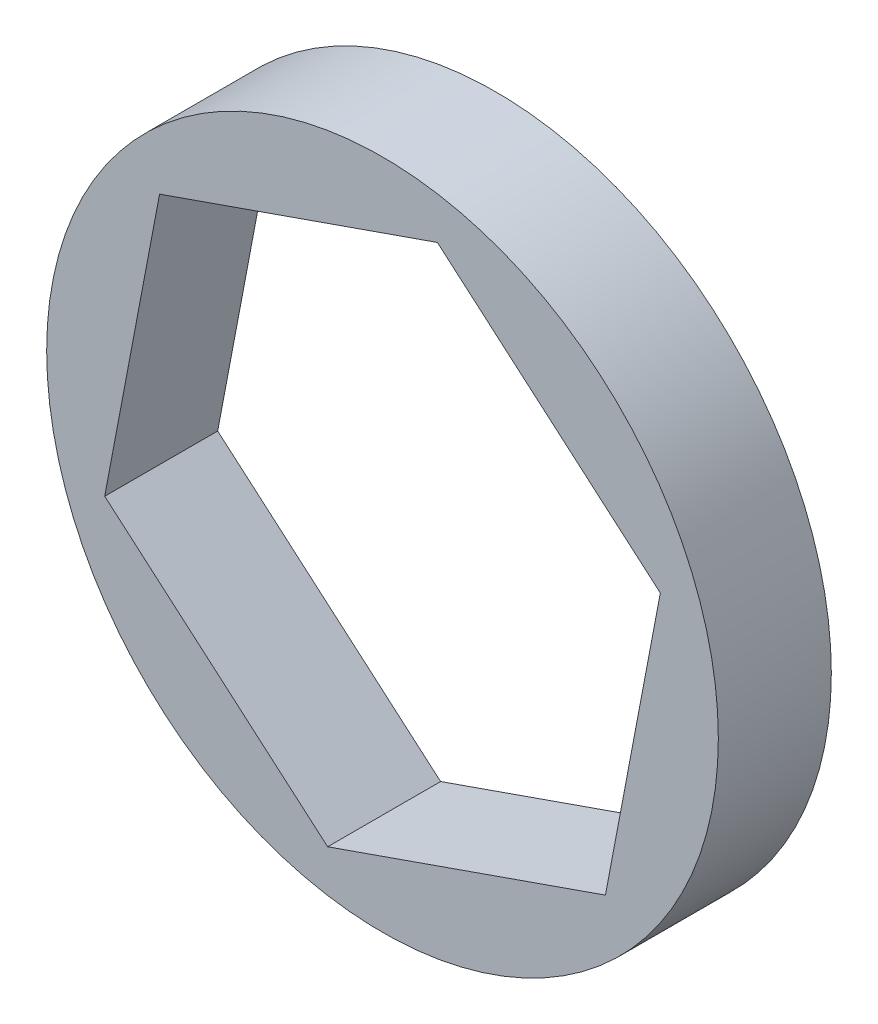
ISO-10303-21;
HEADER;
FILE_DESCRIPTION(('STEP AP214'),'2;1');
FILE_NAME('part.step','',(''),(''),'','','');
FILE_SCHEMA(('AUTOMOTIVE_DESIGN { 1 0 10303 214 1 1 1 1 }'));
ENDSEC;
DATA;
#1=APPLICATION_CONTEXT('core data for automotive mechanical design processes');
#2=APPLICATION_PROTOCOL_DEFINITION('international standard','automotive_design',2000,#1);
#3=PRODUCT_CONTEXT('',#1,'mechanical');
#4=PRODUCT('Part','Part','',(#3));
#5=PRODUCT_RELATED_PRODUCT_CATEGORY('part','',(#4));
#6=PRODUCT_DEFINITION_FORMATION('','',#4);
#7=PRODUCT_DEFINITION_CONTEXT('part definition',#1,'design');
#8=PRODUCT_DEFINITION('design','',#6,#7);
#9=PRODUCT_DEFINITION_SHAPE('','',#8);
#10=(LENGTH_UNIT() NAMED_UNIT(*) SI_UNIT(.MILLI.,.METRE.));
#11=(NAMED_UNIT(*) PLANE_ANGLE_UNIT() SI_UNIT($,.RADIAN.));
#12=(NAMED_UNIT(*) SI_UNIT($,.STERADIAN.) SOLID_ANGLE_UNIT());
#13=UNCERTAINTY_MEASURE_WITH_UNIT(LENGTH_MEASURE(1.E-05),#10,'distance_accuracy_value','');
#14=(GEOMETRIC_REPRESENTATION_CONTEXT(3) GLOBAL_UNCERTAINTY_ASSIGNED_CONTEXT((#13)) GLOBAL_UNIT_ASSIGNED_CONTEXT((#10,
#11,#12)) REPRESENTATION_CONTEXT('',''));
#15=CARTESIAN_POINT('',(0.,0.,0.));
#16=DIRECTION('',(0.,0.,1.));
#17=DIRECTION('',(1.,0.,0.));
#18=AXIS2_PLACEMENT_3D('',#15,#16,#17);
#19=CARTESIAN_POINT('',(0.,0.,2.86));
#20=DIRECTION('',(0.,0.,1.));
#21=DIRECTION('',(1.,0.,0.));
#22=AXIS2_PLACEMENT_3D('',#19,#20,#21);
#23=PLANE('',#22);
#24=CARTESIAN_POINT('',(0.,0.,2.86));
#25=DIRECTION('',(0.,0.,1.));
#26=DIRECTION('',(1.,0.,0.));
#27=AXIS2_PLACEMENT_3D('',#24,#25,#26);
#28=CIRCLE('',#27,8.5);
#29=CARTESIAN_POINT('',(8.5,0.,2.86));
#30=VERTEX_POINT('',#29);
#31=EDGE_CURVE('E11',#30,#30,#28,.T.);
#32=ORIENTED_EDGE('',*,*,#31,.T.);
#33=EDGE_LOOP('',(#32));
#34=FACE_BOUND('',#33,.T.);
#35=DIRECTION('',(-0.186458252242842,-0.98246288488194,0.));
#36=VECTOR('',#35,1.);
#37=CARTESIAN_POINT('',(-5.64253204702186,4.8612583789726,2.86));
#38=LINE('',#37,#36);
#39=CARTESIAN_POINT('',(-5.64253204702186,4.8612583789726,2.86));
#40=VERTEX_POINT('',#39);
#41=CARTESIAN_POINT('',(-7.03123927406116,-2.45594690490245,2.86));
#42=VERTEX_POINT('',#41);
#43=EDGE_CURVE('E94',#40,#42,#38,.T.);
#44=ORIENTED_EDGE('',*,*,#43,.F.);
#45=DIRECTION('',(-0.944066942704528,-0.329753859253422,0.));
#46=VECTOR('',#45,1.);
#47=CARTESIAN_POINT('',(1.3887072270393,7.31720528387504,2.86));
#48=LINE('',#47,#46);
#49=CARTESIAN_POINT('',(1.3887072270393,7.31720528387504,2.86));
#50=VERTEX_POINT('',#49);
#51=EDGE_CURVE('E86',#50,#40,#48,.T.);
#52=ORIENTED_EDGE('',*,*,#51,.F.);
#53=DIRECTION('',(-0.757608690461686,0.652709025628518,0.));
#54=VECTOR('',#53,1.);
#55=CARTESIAN_POINT('',(7.03123927406116,2.45594690490244,2.86));
#56=LINE('',#55,#54);
#57=CARTESIAN_POINT('',(7.03123927406116,2.45594690490244,2.86));
#58=VERTEX_POINT('',#57);
#59=EDGE_CURVE('E114',#58,#50,#56,.T.);
#60=ORIENTED_EDGE('',*,*,#59,.F.);
#61=DIRECTION('',(0.186458252242842,0.98246288488194,0.));
#62=VECTOR('',#61,1.);
#63=CARTESIAN_POINT('',(5.64253204702186,-4.8612583789726,2.86));
#64=LINE('',#63,#62);
#65=CARTESIAN_POINT('',(5.64253204702186,-4.8612583789726,2.86));
#66=VERTEX_POINT('',#65);
#67=EDGE_CURVE('E112',#66,#58,#64,.T.);
#68=ORIENTED_EDGE('',*,*,#67,.F.);
#69=DIRECTION('',(0.944066942704528,0.329753859253422,0.));
#70=VECTOR('',#69,1.);
#71=CARTESIAN_POINT('',(-1.3887072270393,-7.31720528387504,2.86));
#72=LINE('',#71,#70);
#73=CARTESIAN_POINT('',(-1.3887072270393,-7.31720528387504,2.86));
#74=VERTEX_POINT('',#73);
#75=EDGE_CURVE('E108',#74,#66,#72,.T.);
#76=ORIENTED_EDGE('',*,*,#75,.F.);
#77=DIRECTION('',(0.757608690461686,-0.652709025628518,0.));
#78=VECTOR('',#77,1.);
#79=CARTESIAN_POINT('',(-7.03123927406116,-2.45594690490245,2.86));
#80=LINE('',#79,#78);
#81=EDGE_CURVE('E106',#42,#74,#80,.T.);
#82=ORIENTED_EDGE('',*,*,#81,.F.);
#83=EDGE_LOOP('',(#44,#52,#60,#68,#76,#82));
#84=FACE_BOUND('',#83,.T.);
#85=ADVANCED_FACE('F33',(#34,#84),#23,.T.);
#86=CARTESIAN_POINT('',(0.,0.,0.));
#87=DIRECTION('',(0.,0.,1.));
#88=DIRECTION('',(1.,0.,0.));
#89=AXIS2_PLACEMENT_3D('',#86,#87,#88);
#90=PLANE('',#89);
#91=CARTESIAN_POINT('',(0.,0.,0.));
#92=DIRECTION('',(0.,0.,1.));
#93=DIRECTION('',(1.,0.,0.));
#94=AXIS2_PLACEMENT_3D('',#91,#92,#93);
#95=CIRCLE('',#94,8.5);
#96=CARTESIAN_POINT('',(8.5,0.,0.));
#97=VERTEX_POINT('',#96);
#98=EDGE_CURVE('E37',#97,#97,#95,.T.);
#99=ORIENTED_EDGE('',*,*,#98,.F.);
#100=EDGE_LOOP('',(#99));
#101=FACE_BOUND('',#100,.T.);
#102=DIRECTION('',(-0.944066942704528,-0.329753859253422,0.));
#103=VECTOR('',#102,1.);
#104=CARTESIAN_POINT('',(1.3887072270393,7.31720528387504,0.));
#105=LINE('',#104,#103);
#106=CARTESIAN_POINT('',(1.3887072270393,7.31720528387504,0.));
#107=VERTEX_POINT('',#106);
#108=CARTESIAN_POINT('',(-5.64253204702186,4.8612583789726,0.));
#109=VERTEX_POINT('',#108);
#110=EDGE_CURVE('E56',#107,#109,#105,.T.);
#111=ORIENTED_EDGE('',*,*,#110,.T.);
#112=DIRECTION('',(-0.186458252242842,-0.98246288488194,0.));
#113=VECTOR('',#112,1.);
#114=CARTESIAN_POINT('',(-5.64253204702186,4.8612583789726,0.));
#115=LINE('',#114,#113);
#116=CARTESIAN_POINT('',(-7.03123927406116,-2.45594690490245,0.));
#117=VERTEX_POINT('',#116);
#118=EDGE_CURVE('E101',#109,#117,#115,.T.);
#119=ORIENTED_EDGE('',*,*,#118,.T.);
#120=DIRECTION('',(0.757608690461686,-0.652709025628518,0.));
#121=VECTOR('',#120,1.);
#122=CARTESIAN_POINT('',(-7.03123927406116,-2.45594690490245,0.));
#123=LINE('',#122,#121);
#124=CARTESIAN_POINT('',(-1.3887072270393,-7.31720528387504,0.));
#125=VERTEX_POINT('',#124);
#126=EDGE_CURVE('E118',#117,#125,#123,.T.);
#127=ORIENTED_EDGE('',*,*,#126,.T.);
#128=DIRECTION('',(0.944066942704528,0.329753859253422,0.));
#129=VECTOR('',#128,1.);
#130=CARTESIAN_POINT('',(-1.3887072270393,-7.31720528387504,0.));
#131=LINE('',#130,#129);
#132=CARTESIAN_POINT('',(5.64253204702186,-4.8612583789726,0.));
#133=VERTEX_POINT('',#132);
#134=EDGE_CURVE('E121',#125,#133,#131,.T.);
#135=ORIENTED_EDGE('',*,*,#134,.T.);
#136=DIRECTION('',(0.186458252242842,0.98246288488194,0.));
#137=VECTOR('',#136,1.);
#138=CARTESIAN_POINT('',(5.64253204702186,-4.8612583789726,0.));
#139=LINE('',#138,#137);
#140=CARTESIAN_POINT('',(7.03123927406116,2.45594690490244,0.));
#141=VERTEX_POINT('',#140);
#142=EDGE_CURVE('E124',#133,#141,#139,.T.);
#143=ORIENTED_EDGE('',*,*,#142,.T.);
#144=DIRECTION('',(-0.757608690461686,0.652709025628518,0.));
#145=VECTOR('',#144,1.);
#146=CARTESIAN_POINT('',(7.03123927406116,2.45594690490244,0.));
#147=LINE('',#146,#145);
#148=EDGE_CURVE('E95',#141,#107,#147,.T.);
#149=ORIENTED_EDGE('',*,*,#148,.T.);
#150=EDGE_LOOP('',(#111,#119,#127,#135,#143,#149));
#151=FACE_BOUND('',#150,.T.);
#152=ADVANCED_FACE('F141',(#101,#151),#90,.F.);
#153=CARTESIAN_POINT('',(0.,0.,2.86));
#154=DIRECTION('',(0.,0.,-1.));
#155=DIRECTION('',(-1.,0.,0.));
#156=AXIS2_PLACEMENT_3D('',#153,#154,#155);
#157=CYLINDRICAL_SURFACE('',#156,8.5);
#158=ORIENTED_EDGE('',*,*,#31,.F.);
#159=EDGE_LOOP('',(#158));
#160=FACE_BOUND('',#159,.T.);
#161=ORIENTED_EDGE('',*,*,#98,.T.);
#162=EDGE_LOOP('',(#161));
#163=FACE_BOUND('',#162,.T.);
#164=ADVANCED_FACE('F35',(#160,#163),#157,.T.);
#165=CARTESIAN_POINT('',(1.3887072270393,7.31720528387504,2.86));
#166=DIRECTION('',(0.329753859253422,-0.944066942704528,0.));
#167=DIRECTION('',(0.944066942704528,0.329753859253422,0.));
#168=AXIS2_PLACEMENT_3D('',#165,#166,#167);
#169=PLANE('',#168);
#170=ORIENTED_EDGE('',*,*,#110,.F.);
#171=DIRECTION('',(0.,0.,-1.));
#172=VECTOR('',#171,1.);
#173=CARTESIAN_POINT('',(1.3887072270393,7.31720528387504,2.86));
#174=LINE('',#173,#172);
#175=EDGE_CURVE('E90',#50,#107,#174,.T.);
#176=ORIENTED_EDGE('',*,*,#175,.F.);
#177=ORIENTED_EDGE('',*,*,#51,.T.);
#178=DIRECTION('',(0.,0.,-1.));
#179=VECTOR('',#178,1.);
#180=CARTESIAN_POINT('',(-5.64253204702186,4.8612583789726,2.86));
#181=LINE('',#180,#179);
#182=EDGE_CURVE('E89',#40,#109,#181,.T.);
#183=ORIENTED_EDGE('',*,*,#182,.T.);
#184=EDGE_LOOP('',(#170,#176,#177,#183));
#185=FACE_BOUND('',#184,.T.);
#186=ADVANCED_FACE('F88',(#185),#169,.T.);
#187=CARTESIAN_POINT('',(-5.64253204702186,4.8612583789726,2.86));
#188=DIRECTION('',(0.98246288488194,-0.186458252242842,0.));
#189=DIRECTION('',(0.186458252242842,0.98246288488194,0.));
#190=AXIS2_PLACEMENT_3D('',#187,#188,#189);
#191=PLANE('',#190);
#192=ORIENTED_EDGE('',*,*,#118,.F.);
#193=ORIENTED_EDGE('',*,*,#182,.F.);
#194=ORIENTED_EDGE('',*,*,#43,.T.);
#195=DIRECTION('',(0.,0.,-1.));
#196=VECTOR('',#195,1.);
#197=CARTESIAN_POINT('',(-7.03123927406116,-2.45594690490245,2.86));
#198=LINE('',#197,#196);
#199=EDGE_CURVE('E102',#42,#117,#198,.T.);
#200=ORIENTED_EDGE('',*,*,#199,.T.);
#201=EDGE_LOOP('',(#192,#193,#194,#200));
#202=FACE_BOUND('',#201,.T.);
#203=ADVANCED_FACE('F98',(#202),#191,.T.);
#204=CARTESIAN_POINT('',(-7.03123927406116,-2.45594690490245,2.86));
#205=DIRECTION('',(0.652709025628518,0.757608690461686,0.));
#206=DIRECTION('',(-0.757608690461686,0.652709025628518,0.));
#207=AXIS2_PLACEMENT_3D('',#204,#205,#206);
#208=PLANE('',#207);
#209=ORIENTED_EDGE('',*,*,#126,.F.);
#210=ORIENTED_EDGE('',*,*,#199,.F.);
#211=ORIENTED_EDGE('',*,*,#81,.T.);
#212=DIRECTION('',(0.,0.,-1.));
#213=VECTOR('',#212,1.);
#214=CARTESIAN_POINT('',(-1.3887072270393,-7.31720528387504,2.86));
#215=LINE('',#214,#213);
#216=EDGE_CURVE('E133',#74,#125,#215,.T.);
#217=ORIENTED_EDGE('',*,*,#216,.T.);
#218=EDGE_LOOP('',(#209,#210,#211,#217));
#219=FACE_BOUND('',#218,.T.);
#220=ADVANCED_FACE('F137',(#219),#208,.T.);
#221=CARTESIAN_POINT('',(-1.3887072270393,-7.31720528387504,2.86));
#222=DIRECTION('',(-0.329753859253422,0.944066942704528,0.));
#223=DIRECTION('',(-0.944066942704528,-0.329753859253422,0.));
#224=AXIS2_PLACEMENT_3D('',#221,#222,#223);
#225=PLANE('',#224);
#226=ORIENTED_EDGE('',*,*,#134,.F.);
#227=ORIENTED_EDGE('',*,*,#216,.F.);
#228=ORIENTED_EDGE('',*,*,#75,.T.);
#229=DIRECTION('',(0.,0.,-1.));
#230=VECTOR('',#229,1.);
#231=CARTESIAN_POINT('',(5.64253204702186,-4.8612583789726,2.86));
#232=LINE('',#231,#230);
#233=EDGE_CURVE('E131',#66,#133,#232,.T.);
#234=ORIENTED_EDGE('',*,*,#233,.T.);
#235=EDGE_LOOP('',(#226,#227,#228,#234));
#236=FACE_BOUND('',#235,.T.);
#237=ADVANCED_FACE('F149',(#236),#225,.T.);
#238=CARTESIAN_POINT('',(5.64253204702186,-4.8612583789726,2.86));
#239=DIRECTION('',(-0.98246288488194,0.186458252242842,0.));
#240=DIRECTION('',(-0.186458252242842,-0.98246288488194,0.));
#241=AXIS2_PLACEMENT_3D('',#238,#239,#240);
#242=PLANE('',#241);
#243=ORIENTED_EDGE('',*,*,#142,.F.);
#244=ORIENTED_EDGE('',*,*,#233,.F.);
#245=ORIENTED_EDGE('',*,*,#67,.T.);
#246=DIRECTION('',(0.,0.,-1.));
#247=VECTOR('',#246,1.);
#248=CARTESIAN_POINT('',(7.03123927406116,2.45594690490244,2.86));
#249=LINE('',#248,#247);
#250=EDGE_CURVE('E48',#58,#141,#249,.T.);
#251=ORIENTED_EDGE('',*,*,#250,.T.);
#252=EDGE_LOOP('',(#243,#244,#245,#251));
#253=FACE_BOUND('',#252,.T.);
#254=ADVANCED_FACE('F147',(#253),#242,.T.);
#255=CARTESIAN_POINT('',(7.03123927406116,2.45594690490244,2.86));
#256=DIRECTION('',(-0.652709025628518,-0.757608690461686,0.));
#257=DIRECTION('',(0.757608690461686,-0.652709025628518,0.));
#258=AXIS2_PLACEMENT_3D('',#255,#256,#257);
#259=PLANE('',#258);
#260=ORIENTED_EDGE('',*,*,#148,.F.);
#261=ORIENTED_EDGE('',*,*,#250,.F.);
#262=ORIENTED_EDGE('',*,*,#59,.T.);
#263=ORIENTED_EDGE('',*,*,#175,.T.);
#264=EDGE_LOOP('',(#260,#261,#262,#263));
#265=FACE_BOUND('',#264,.T.);
#266=ADVANCED_FACE('F143',(#265),#259,.T.);
#267=CLOSED_SHELL('',(#85,#152,#164,#186,#203,#220,#237,#254,#266));
#268=MANIFOLD_SOLID_BREP('B2',#267);
#269=ADVANCED_BREP_SHAPE_REPRESENTATION('',(#18,#268),#14);
#270=SHAPE_DEFINITION_REPRESENTATION(#9,#269);
ENDSEC;
END-ISO-10303-21;
